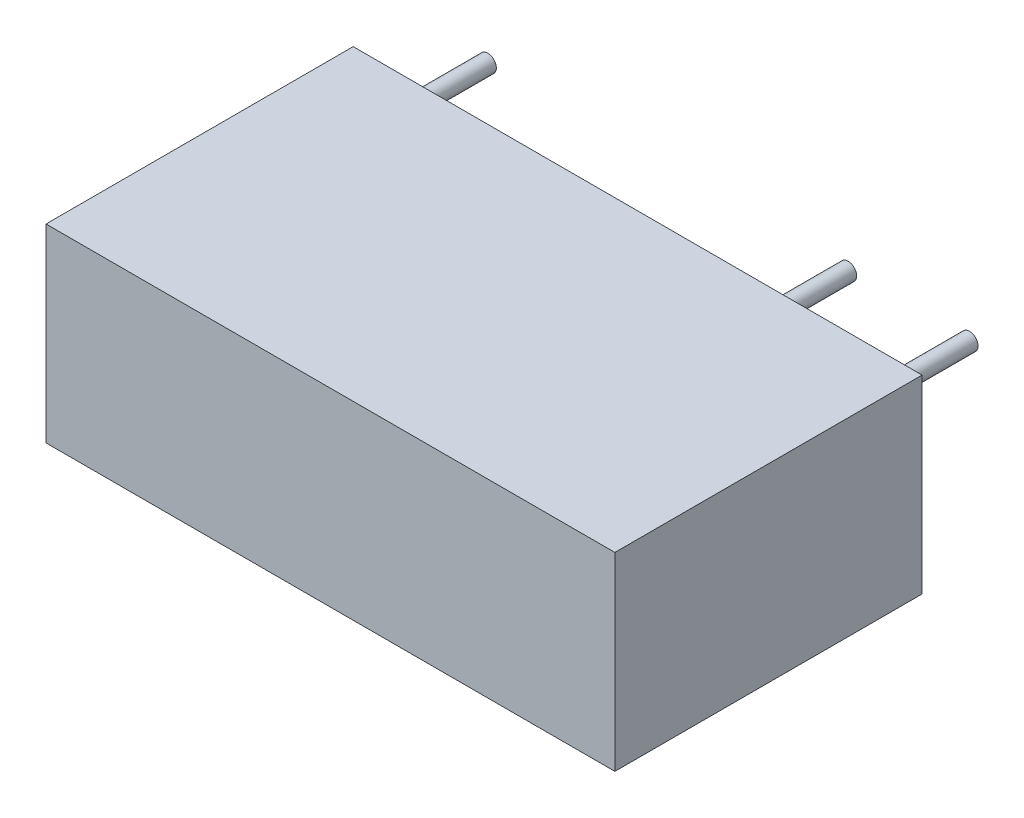
ISO-10303-21;
HEADER;
FILE_DESCRIPTION(('STEP AP214'),'2;1');
FILE_NAME('part.step','',(''),(''),'','','');
FILE_SCHEMA(('AUTOMOTIVE_DESIGN { 1 0 10303 214 1 1 1 1 }'));
ENDSEC;
DATA;
#1=APPLICATION_CONTEXT('core data for automotive mechanical design processes');
#2=APPLICATION_PROTOCOL_DEFINITION('international standard','automotive_design',2000,#1);
#3=PRODUCT_CONTEXT('',#1,'mechanical');
#4=PRODUCT('Part','Part','',(#3));
#5=PRODUCT_RELATED_PRODUCT_CATEGORY('part','',(#4));
#6=PRODUCT_DEFINITION_FORMATION('','',#4);
#7=PRODUCT_DEFINITION_CONTEXT('part definition',#1,'design');
#8=PRODUCT_DEFINITION('design','',#6,#7);
#9=PRODUCT_DEFINITION_SHAPE('','',#8);
#10=(LENGTH_UNIT() NAMED_UNIT(*) SI_UNIT(.MILLI.,.METRE.));
#11=(NAMED_UNIT(*) PLANE_ANGLE_UNIT() SI_UNIT($,.RADIAN.));
#12=(NAMED_UNIT(*) SI_UNIT($,.STERADIAN.) SOLID_ANGLE_UNIT());
#13=UNCERTAINTY_MEASURE_WITH_UNIT(LENGTH_MEASURE(1.E-05),#10,'distance_accuracy_value','');
#14=(GEOMETRIC_REPRESENTATION_CONTEXT(3) GLOBAL_UNCERTAINTY_ASSIGNED_CONTEXT((#13)) GLOBAL_UNIT_ASSIGNED_CONTEXT((#10,
#11,#12)) REPRESENTATION_CONTEXT('',''));
#15=CARTESIAN_POINT('',(0.,0.,0.));
#16=DIRECTION('',(0.,0.,1.));
#17=DIRECTION('',(1.,0.,0.));
#18=AXIS2_PLACEMENT_3D('',#15,#16,#17);
#19=CARTESIAN_POINT('',(15.,-5.,16.2));
#20=DIRECTION('',(-1.,0.,0.));
#21=DIRECTION('',(0.,0.,1.));
#22=AXIS2_PLACEMENT_3D('',#19,#20,#21);
#23=PLANE('',#22);
#24=DIRECTION('',(0.,1.,0.));
#25=VECTOR('',#24,1.);
#26=CARTESIAN_POINT('',(15.,-5.,0.));
#27=LINE('',#26,#25);
#28=CARTESIAN_POINT('',(15.,-5.,0.));
#29=VERTEX_POINT('',#28);
#30=CARTESIAN_POINT('',(15.,5.,0.));
#31=VERTEX_POINT('',#30);
#32=EDGE_CURVE('E96',#29,#31,#27,.T.);
#33=ORIENTED_EDGE('',*,*,#32,.T.);
#34=DIRECTION('',(0.,0.,-1.));
#35=VECTOR('',#34,1.);
#36=CARTESIAN_POINT('',(15.,5.,16.2));
#37=LINE('',#36,#35);
#38=CARTESIAN_POINT('',(15.,5.,16.2));
#39=VERTEX_POINT('',#38);
#40=EDGE_CURVE('E11',#39,#31,#37,.T.);
#41=ORIENTED_EDGE('',*,*,#40,.F.);
#42=DIRECTION('',(0.,1.,0.));
#43=VECTOR('',#42,1.);
#44=CARTESIAN_POINT('',(15.,-5.,16.2));
#45=LINE('',#44,#43);
#46=CARTESIAN_POINT('',(15.,-5.,16.2));
#47=VERTEX_POINT('',#46);
#48=EDGE_CURVE('E84',#47,#39,#45,.T.);
#49=ORIENTED_EDGE('',*,*,#48,.F.);
#50=DIRECTION('',(0.,0.,-1.));
#51=VECTOR('',#50,1.);
#52=CARTESIAN_POINT('',(15.,-5.,16.2));
#53=LINE('',#52,#51);
#54=EDGE_CURVE('E92',#47,#29,#53,.T.);
#55=ORIENTED_EDGE('',*,*,#54,.T.);
#56=EDGE_LOOP('',(#33,#41,#49,#55));
#57=FACE_BOUND('',#56,.T.);
#58=ADVANCED_FACE('F33',(#57),#23,.F.);
#59=CARTESIAN_POINT('',(-15.,5.,16.2));
#60=DIRECTION('',(0.,-1.,0.));
#61=DIRECTION('',(0.,0.,-1.));
#62=AXIS2_PLACEMENT_3D('',#59,#60,#61);
#63=PLANE('',#62);
#64=DIRECTION('',(-1.,0.,0.));
#65=VECTOR('',#64,1.);
#66=CARTESIAN_POINT('',(-15.,5.,0.));
#67=LINE('',#66,#65);
#68=CARTESIAN_POINT('',(-15.,5.,0.));
#69=VERTEX_POINT('',#68);
#70=EDGE_CURVE('E88',#31,#69,#67,.T.);
#71=ORIENTED_EDGE('',*,*,#70,.T.);
#72=DIRECTION('',(0.,0.,-1.));
#73=VECTOR('',#72,1.);
#74=CARTESIAN_POINT('',(-15.,5.,16.2));
#75=LINE('',#74,#73);
#76=CARTESIAN_POINT('',(-15.,5.,16.2));
#77=VERTEX_POINT('',#76);
#78=EDGE_CURVE('E41',#77,#69,#75,.T.);
#79=ORIENTED_EDGE('',*,*,#78,.F.);
#80=DIRECTION('',(-1.,0.,0.));
#81=VECTOR('',#80,1.);
#82=CARTESIAN_POINT('',(-15.,5.,16.2));
#83=LINE('',#82,#81);
#84=EDGE_CURVE('E79',#39,#77,#83,.T.);
#85=ORIENTED_EDGE('',*,*,#84,.F.);
#86=ORIENTED_EDGE('',*,*,#40,.T.);
#87=EDGE_LOOP('',(#71,#79,#85,#86));
#88=FACE_BOUND('',#87,.T.);
#89=ADVANCED_FACE('F87',(#88),#63,.F.);
#90=CARTESIAN_POINT('',(-15.,-5.,16.2));
#91=DIRECTION('',(1.,0.,0.));
#92=DIRECTION('',(0.,0.,-1.));
#93=AXIS2_PLACEMENT_3D('',#90,#91,#92);
#94=PLANE('',#93);
#95=DIRECTION('',(0.,-1.,0.));
#96=VECTOR('',#95,1.);
#97=CARTESIAN_POINT('',(-15.,-5.,0.));
#98=LINE('',#97,#96);
#99=CARTESIAN_POINT('',(-15.,-5.,0.));
#100=VERTEX_POINT('',#99);
#101=EDGE_CURVE('E66',#69,#100,#98,.T.);
#102=ORIENTED_EDGE('',*,*,#101,.T.);
#103=DIRECTION('',(0.,0.,-1.));
#104=VECTOR('',#103,1.);
#105=CARTESIAN_POINT('',(-15.,-5.,16.2));
#106=LINE('',#105,#104);
#107=CARTESIAN_POINT('',(-15.,-5.,16.2));
#108=VERTEX_POINT('',#107);
#109=EDGE_CURVE('E89',#108,#100,#106,.T.);
#110=ORIENTED_EDGE('',*,*,#109,.F.);
#111=DIRECTION('',(0.,-1.,0.));
#112=VECTOR('',#111,1.);
#113=CARTESIAN_POINT('',(-15.,-5.,16.2));
#114=LINE('',#113,#112);
#115=EDGE_CURVE('E82',#77,#108,#114,.T.);
#116=ORIENTED_EDGE('',*,*,#115,.F.);
#117=ORIENTED_EDGE('',*,*,#78,.T.);
#118=EDGE_LOOP('',(#102,#110,#116,#117));
#119=FACE_BOUND('',#118,.T.);
#120=ADVANCED_FACE('F90',(#119),#94,.F.);
#121=CARTESIAN_POINT('',(-15.,-5.,16.2));
#122=DIRECTION('',(0.,1.,0.));
#123=DIRECTION('',(0.,0.,1.));
#124=AXIS2_PLACEMENT_3D('',#121,#122,#123);
#125=PLANE('',#124);
#126=DIRECTION('',(1.,0.,0.));
#127=VECTOR('',#126,1.);
#128=CARTESIAN_POINT('',(-15.,-5.,0.));
#129=LINE('',#128,#127);
#130=EDGE_CURVE('E72',#100,#29,#129,.T.);
#131=ORIENTED_EDGE('',*,*,#130,.T.);
#132=ORIENTED_EDGE('',*,*,#54,.F.);
#133=DIRECTION('',(1.,0.,0.));
#134=VECTOR('',#133,1.);
#135=CARTESIAN_POINT('',(-15.,-5.,16.2));
#136=LINE('',#135,#134);
#137=EDGE_CURVE('E49',#108,#47,#136,.T.);
#138=ORIENTED_EDGE('',*,*,#137,.F.);
#139=ORIENTED_EDGE('',*,*,#109,.T.);
#140=EDGE_LOOP('',(#131,#132,#138,#139));
#141=FACE_BOUND('',#140,.T.);
#142=ADVANCED_FACE('F104',(#141),#125,.F.);
#143=CARTESIAN_POINT('',(0.,0.,16.2));
#144=DIRECTION('',(0.,0.,-1.));
#145=DIRECTION('',(-1.,0.,0.));
#146=AXIS2_PLACEMENT_3D('',#143,#144,#145);
#147=PLANE('',#146);
#148=ORIENTED_EDGE('',*,*,#48,.T.);
#149=ORIENTED_EDGE('',*,*,#84,.T.);
#150=ORIENTED_EDGE('',*,*,#115,.T.);
#151=ORIENTED_EDGE('',*,*,#137,.T.);
#152=EDGE_LOOP('',(#148,#149,#150,#151));
#153=FACE_BOUND('',#152,.T.);
#154=ADVANCED_FACE('F80',(#153),#147,.F.);
#155=CARTESIAN_POINT('',(0.,0.,0.));
#156=DIRECTION('',(0.,0.,-1.));
#157=DIRECTION('',(-1.,0.,0.));
#158=AXIS2_PLACEMENT_3D('',#155,#156,#157);
#159=PLANE('',#158);
#160=CARTESIAN_POINT('',(-11.9,-3.8,0.));
#161=DIRECTION('',(0.,0.,-1.));
#162=DIRECTION('',(-1.,0.,0.));
#163=AXIS2_PLACEMENT_3D('',#160,#161,#162);
#164=CIRCLE('',#163,0.45);
#165=CARTESIAN_POINT('',(-12.35,-3.8,0.));
#166=VERTEX_POINT('',#165);
#167=EDGE_CURVE('E134',#166,#166,#164,.T.);
#168=ORIENTED_EDGE('',*,*,#167,.F.);
#169=EDGE_LOOP('',(#168));
#170=FACE_BOUND('',#169,.T.);
#171=CARTESIAN_POINT('',(-11.9,3.8,0.));
#172=DIRECTION('',(0.,0.,-1.));
#173=DIRECTION('',(-1.,0.,0.));
#174=AXIS2_PLACEMENT_3D('',#171,#172,#173);
#175=CIRCLE('',#174,0.45);
#176=CARTESIAN_POINT('',(-12.35,3.8,0.));
#177=VERTEX_POINT('',#176);
#178=EDGE_CURVE('E128',#177,#177,#175,.T.);
#179=ORIENTED_EDGE('',*,*,#178,.F.);
#180=EDGE_LOOP('',(#179));
#181=FACE_BOUND('',#180,.T.);
#182=CARTESIAN_POINT('',(10.3,-3.8,0.));
#183=DIRECTION('',(0.,0.,-1.));
#184=DIRECTION('',(-1.,0.,0.));
#185=AXIS2_PLACEMENT_3D('',#182,#183,#184);
#186=CIRCLE('',#185,0.45);
#187=CARTESIAN_POINT('',(9.84999999999999,-3.8,0.));
#188=VERTEX_POINT('',#187);
#189=EDGE_CURVE('E122',#188,#188,#186,.T.);
#190=ORIENTED_EDGE('',*,*,#189,.F.);
#191=EDGE_LOOP('',(#190));
#192=FACE_BOUND('',#191,.T.);
#193=CARTESIAN_POINT('',(7.1,3.8,0.));
#194=DIRECTION('',(0.,0.,-1.));
#195=DIRECTION('',(-1.,0.,0.));
#196=AXIS2_PLACEMENT_3D('',#193,#194,#195);
#197=CIRCLE('',#196,0.45);
#198=CARTESIAN_POINT('',(6.65,3.8,0.));
#199=VERTEX_POINT('',#198);
#200=EDGE_CURVE('E116',#199,#199,#197,.T.);
#201=ORIENTED_EDGE('',*,*,#200,.F.);
#202=EDGE_LOOP('',(#201));
#203=FACE_BOUND('',#202,.T.);
#204=CARTESIAN_POINT('',(13.5,3.8,0.));
#205=DIRECTION('',(0.,0.,-1.));
#206=DIRECTION('',(-1.,0.,0.));
#207=AXIS2_PLACEMENT_3D('',#204,#205,#206);
#208=CIRCLE('',#207,0.45);
#209=CARTESIAN_POINT('',(13.05,3.8,0.));
#210=VERTEX_POINT('',#209);
#211=EDGE_CURVE('E110',#210,#210,#208,.T.);
#212=ORIENTED_EDGE('',*,*,#211,.F.);
#213=EDGE_LOOP('',(#212));
#214=FACE_BOUND('',#213,.T.);
#215=ORIENTED_EDGE('',*,*,#32,.F.);
#216=ORIENTED_EDGE('',*,*,#130,.F.);
#217=ORIENTED_EDGE('',*,*,#101,.F.);
#218=ORIENTED_EDGE('',*,*,#70,.F.);
#219=EDGE_LOOP('',(#215,#216,#217,#218));
#220=FACE_BOUND('',#219,.T.);
#221=ADVANCED_FACE('F107',(#170,#181,#192,#203,#214,#220),#159,.T.);
#222=CARTESIAN_POINT('',(13.5,3.8,-4.));
#223=DIRECTION('',(0.,0.,1.));
#224=DIRECTION('',(1.,0.,0.));
#225=AXIS2_PLACEMENT_3D('',#222,#223,#224);
#226=CYLINDRICAL_SURFACE('',#225,0.45);
#227=CARTESIAN_POINT('',(13.5,3.8,-4.));
#228=DIRECTION('',(0.,0.,-1.));
#229=DIRECTION('',(-1.,0.,0.));
#230=AXIS2_PLACEMENT_3D('',#227,#228,#229);
#231=CIRCLE('',#230,0.45);
#232=CARTESIAN_POINT('',(13.05,3.8,-4.));
#233=VERTEX_POINT('',#232);
#234=EDGE_CURVE('E99',#233,#233,#231,.T.);
#235=ORIENTED_EDGE('',*,*,#234,.F.);
#236=EDGE_LOOP('',(#235));
#237=FACE_BOUND('',#236,.T.);
#238=ORIENTED_EDGE('',*,*,#211,.T.);
#239=EDGE_LOOP('',(#238));
#240=FACE_BOUND('',#239,.T.);
#241=ADVANCED_FACE('F151',(#237,#240),#226,.T.);
#242=CARTESIAN_POINT('',(13.5,3.8,-4.));
#243=DIRECTION('',(0.,0.,-1.));
#244=DIRECTION('',(-1.,0.,0.));
#245=AXIS2_PLACEMENT_3D('',#242,#243,#244);
#246=PLANE('',#245);
#247=ORIENTED_EDGE('',*,*,#234,.T.);
#248=EDGE_LOOP('',(#247));
#249=FACE_BOUND('',#248,.T.);
#250=ADVANCED_FACE('F162',(#249),#246,.T.);
#251=CARTESIAN_POINT('',(7.1,3.8,-4.));
#252=DIRECTION('',(0.,0.,1.));
#253=DIRECTION('',(1.,0.,0.));
#254=AXIS2_PLACEMENT_3D('',#251,#252,#253);
#255=CYLINDRICAL_SURFACE('',#254,0.45);
#256=CARTESIAN_POINT('',(7.1,3.8,-4.));
#257=DIRECTION('',(0.,0.,-1.));
#258=DIRECTION('',(-1.,0.,0.));
#259=AXIS2_PLACEMENT_3D('',#256,#257,#258);
#260=CIRCLE('',#259,0.45);
#261=CARTESIAN_POINT('',(6.65,3.8,-4.));
#262=VERTEX_POINT('',#261);
#263=EDGE_CURVE('E113',#262,#262,#260,.T.);
#264=ORIENTED_EDGE('',*,*,#263,.F.);
#265=EDGE_LOOP('',(#264));
#266=FACE_BOUND('',#265,.T.);
#267=ORIENTED_EDGE('',*,*,#200,.T.);
#268=EDGE_LOOP('',(#267));
#269=FACE_BOUND('',#268,.T.);
#270=ADVANCED_FACE('F168',(#266,#269),#255,.T.);
#271=CARTESIAN_POINT('',(7.1,3.8,-4.));
#272=DIRECTION('',(0.,0.,-1.));
#273=DIRECTION('',(-1.,0.,0.));
#274=AXIS2_PLACEMENT_3D('',#271,#272,#273);
#275=PLANE('',#274);
#276=ORIENTED_EDGE('',*,*,#263,.T.);
#277=EDGE_LOOP('',(#276));
#278=FACE_BOUND('',#277,.T.);
#279=ADVANCED_FACE('F211',(#278),#275,.T.);
#280=CARTESIAN_POINT('',(10.3,-3.8,-4.));
#281=DIRECTION('',(0.,0.,1.));
#282=DIRECTION('',(1.,0.,0.));
#283=AXIS2_PLACEMENT_3D('',#280,#281,#282);
#284=CYLINDRICAL_SURFACE('',#283,0.45);
#285=CARTESIAN_POINT('',(10.3,-3.8,-4.));
#286=DIRECTION('',(0.,0.,-1.));
#287=DIRECTION('',(-1.,0.,0.));
#288=AXIS2_PLACEMENT_3D('',#285,#286,#287);
#289=CIRCLE('',#288,0.45);
#290=CARTESIAN_POINT('',(9.84999999999999,-3.8,-4.));
#291=VERTEX_POINT('',#290);
#292=EDGE_CURVE('E119',#291,#291,#289,.T.);
#293=ORIENTED_EDGE('',*,*,#292,.F.);
#294=EDGE_LOOP('',(#293));
#295=FACE_BOUND('',#294,.T.);
#296=ORIENTED_EDGE('',*,*,#189,.T.);
#297=EDGE_LOOP('',(#296));
#298=FACE_BOUND('',#297,.T.);
#299=ADVANCED_FACE('F221',(#295,#298),#284,.T.);
#300=CARTESIAN_POINT('',(10.3,-3.8,-4.));
#301=DIRECTION('',(0.,0.,-1.));
#302=DIRECTION('',(-1.,0.,0.));
#303=AXIS2_PLACEMENT_3D('',#300,#301,#302);
#304=PLANE('',#303);
#305=ORIENTED_EDGE('',*,*,#292,.T.);
#306=EDGE_LOOP('',(#305));
#307=FACE_BOUND('',#306,.T.);
#308=ADVANCED_FACE('F231',(#307),#304,.T.);
#309=CARTESIAN_POINT('',(-11.9,3.8,-4.));
#310=DIRECTION('',(0.,0.,1.));
#311=DIRECTION('',(1.,0.,0.));
#312=AXIS2_PLACEMENT_3D('',#309,#310,#311);
#313=CYLINDRICAL_SURFACE('',#312,0.45);
#314=CARTESIAN_POINT('',(-11.9,3.8,-4.));
#315=DIRECTION('',(0.,0.,-1.));
#316=DIRECTION('',(-1.,0.,0.));
#317=AXIS2_PLACEMENT_3D('',#314,#315,#316);
#318=CIRCLE('',#317,0.45);
#319=CARTESIAN_POINT('',(-12.35,3.8,-4.));
#320=VERTEX_POINT('',#319);
#321=EDGE_CURVE('E125',#320,#320,#318,.T.);
#322=ORIENTED_EDGE('',*,*,#321,.F.);
#323=EDGE_LOOP('',(#322));
#324=FACE_BOUND('',#323,.T.);
#325=ORIENTED_EDGE('',*,*,#178,.T.);
#326=EDGE_LOOP('',(#325));
#327=FACE_BOUND('',#326,.T.);
#328=ADVANCED_FACE('F241',(#324,#327),#313,.T.);
#329=CARTESIAN_POINT('',(-11.9,3.8,-4.));
#330=DIRECTION('',(0.,0.,-1.));
#331=DIRECTION('',(-1.,0.,0.));
#332=AXIS2_PLACEMENT_3D('',#329,#330,#331);
#333=PLANE('',#332);
#334=ORIENTED_EDGE('',*,*,#321,.T.);
#335=EDGE_LOOP('',(#334));
#336=FACE_BOUND('',#335,.T.);
#337=ADVANCED_FACE('F145',(#336),#333,.T.);
#338=CARTESIAN_POINT('',(-11.9,-3.8,-4.));
#339=DIRECTION('',(0.,0.,1.));
#340=DIRECTION('',(1.,0.,0.));
#341=AXIS2_PLACEMENT_3D('',#338,#339,#340);
#342=CYLINDRICAL_SURFACE('',#341,0.45);
#343=CARTESIAN_POINT('',(-11.9,-3.8,-4.));
#344=DIRECTION('',(0.,0.,-1.));
#345=DIRECTION('',(-1.,0.,0.));
#346=AXIS2_PLACEMENT_3D('',#343,#344,#345);
#347=CIRCLE('',#346,0.45);
#348=CARTESIAN_POINT('',(-12.35,-3.8,-4.));
#349=VERTEX_POINT('',#348);
#350=EDGE_CURVE('E131',#349,#349,#347,.T.);
#351=ORIENTED_EDGE('',*,*,#350,.F.);
#352=EDGE_LOOP('',(#351));
#353=FACE_BOUND('',#352,.T.);
#354=ORIENTED_EDGE('',*,*,#167,.T.);
#355=EDGE_LOOP('',(#354));
#356=FACE_BOUND('',#355,.T.);
#357=ADVANCED_FACE('F142',(#353,#356),#342,.T.);
#358=CARTESIAN_POINT('',(-11.9,-3.8,-4.));
#359=DIRECTION('',(0.,0.,-1.));
#360=DIRECTION('',(-1.,0.,0.));
#361=AXIS2_PLACEMENT_3D('',#358,#359,#360);
#362=PLANE('',#361);
#363=ORIENTED_EDGE('',*,*,#350,.T.);
#364=EDGE_LOOP('',(#363));
#365=FACE_BOUND('',#364,.T.);
#366=ADVANCED_FACE('F140',(#365),#362,.T.);
#367=CLOSED_SHELL('',(#58,#89,#120,#142,#154,#221,#241,#250,#270,#279,#299,#308,#328,#337,#357,#366));
#368=MANIFOLD_SOLID_BREP('B2',#367);
#369=ADVANCED_BREP_SHAPE_REPRESENTATION('',(#18,#368),#14);
#370=SHAPE_DEFINITION_REPRESENTATION(#9,#369);
ENDSEC;
END-ISO-10303-21;
